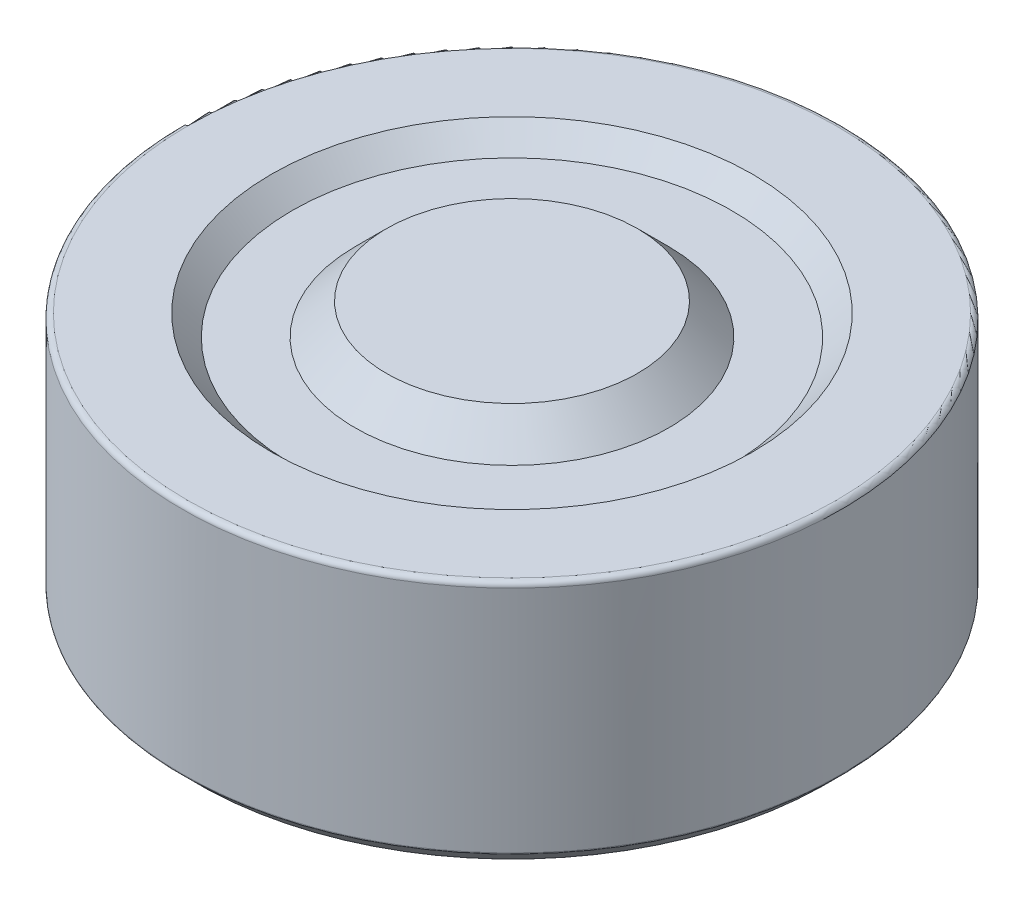
ISO-10303-21;
HEADER;
FILE_DESCRIPTION(('STEP AP214'),'2;1');
FILE_NAME('part.step','',(''),(''),'','','');
FILE_SCHEMA(('AUTOMOTIVE_DESIGN { 1 0 10303 214 1 1 1 1 }'));
ENDSEC;
DATA;
#1=APPLICATION_CONTEXT('core data for automotive mechanical design processes');
#2=APPLICATION_PROTOCOL_DEFINITION('international standard','automotive_design',2000,#1);
#3=PRODUCT_CONTEXT('',#1,'mechanical');
#4=PRODUCT('Part','Part','',(#3));
#5=PRODUCT_RELATED_PRODUCT_CATEGORY('part','',(#4));
#6=PRODUCT_DEFINITION_FORMATION('','',#4);
#7=PRODUCT_DEFINITION_CONTEXT('part definition',#1,'design');
#8=PRODUCT_DEFINITION('design','',#6,#7);
#9=PRODUCT_DEFINITION_SHAPE('','',#8);
#10=(LENGTH_UNIT() NAMED_UNIT(*) SI_UNIT(.MILLI.,.METRE.));
#11=(NAMED_UNIT(*) PLANE_ANGLE_UNIT() SI_UNIT($,.RADIAN.));
#12=(NAMED_UNIT(*) SI_UNIT($,.STERADIAN.) SOLID_ANGLE_UNIT());
#13=UNCERTAINTY_MEASURE_WITH_UNIT(LENGTH_MEASURE(1.E-05),#10,'distance_accuracy_value','');
#14=(GEOMETRIC_REPRESENTATION_CONTEXT(3) GLOBAL_UNCERTAINTY_ASSIGNED_CONTEXT((#13)) GLOBAL_UNIT_ASSIGNED_CONTEXT((#10,
#11,#12)) REPRESENTATION_CONTEXT('',''));
#15=CARTESIAN_POINT('',(0.,0.,0.));
#16=DIRECTION('',(0.,0.,1.));
#17=DIRECTION('',(1.,0.,0.));
#18=AXIS2_PLACEMENT_3D('',#15,#16,#17);
#19=CARTESIAN_POINT('',(0.,16.5,0.));
#20=DIRECTION('',(0.,-1.,0.));
#21=DIRECTION('',(0.,0.,-1.));
#22=AXIS2_PLACEMENT_3D('',#19,#20,#21);
#23=CONICAL_SURFACE('',#22,15.,0.785398163397448);
#24=CARTESIAN_POINT('',(0.,19.5,0.));
#25=DIRECTION('',(0.,-1.,0.));
#26=DIRECTION('',(0.,0.,-1.));
#27=AXIS2_PLACEMENT_3D('',#24,#25,#26);
#28=CIRCLE('',#27,12.);
#29=CARTESIAN_POINT('',(0.,19.5,-12.));
#30=VERTEX_POINT('',#29);
#31=EDGE_CURVE('E47',#30,#30,#28,.F.);
#32=ORIENTED_EDGE('',*,*,#31,.F.);
#33=EDGE_LOOP('',(#32));
#34=FACE_BOUND('',#33,.T.);
#35=CARTESIAN_POINT('',(0.,16.5,0.));
#36=DIRECTION('',(0.,-1.,0.));
#37=DIRECTION('',(-1.,0.,0.));
#38=AXIS2_PLACEMENT_3D('',#35,#36,#37);
#39=CIRCLE('',#38,15.);
#40=CARTESIAN_POINT('',(-15.,16.5,0.));
#41=VERTEX_POINT('',#40);
#42=EDGE_CURVE('E53',#41,#41,#39,.T.);
#43=ORIENTED_EDGE('',*,*,#42,.F.);
#44=EDGE_LOOP('',(#43));
#45=FACE_BOUND('',#44,.T.);
#46=ADVANCED_FACE('F17',(#34,#45),#23,.T.);
#47=CARTESIAN_POINT('',(0.,16.5,0.));
#48=DIRECTION('',(0.,-1.,0.));
#49=DIRECTION('',(1.,0.,0.));
#50=AXIS2_PLACEMENT_3D('',#47,#48,#49);
#51=PLANE('',#50);
#52=ORIENTED_EDGE('',*,*,#42,.T.);
#53=EDGE_LOOP('',(#52));
#54=FACE_BOUND('',#53,.T.);
#55=CARTESIAN_POINT('',(0.,16.5,0.));
#56=DIRECTION('',(0.,-1.,0.));
#57=DIRECTION('',(-1.,0.,0.));
#58=AXIS2_PLACEMENT_3D('',#55,#56,#57);
#59=CIRCLE('',#58,21.);
#60=CARTESIAN_POINT('',(-21.,16.5,0.));
#61=VERTEX_POINT('',#60);
#62=EDGE_CURVE('E49',#61,#61,#59,.T.);
#63=ORIENTED_EDGE('',*,*,#62,.F.);
#64=EDGE_LOOP('',(#63));
#65=FACE_BOUND('',#64,.T.);
#66=ADVANCED_FACE('F84',(#54,#65),#51,.F.);
#67=CARTESIAN_POINT('',(0.,18.5,0.));
#68=DIRECTION('',(0.,1.,0.));
#69=DIRECTION('',(0.,0.,1.));
#70=AXIS2_PLACEMENT_3D('',#67,#68,#69);
#71=CONICAL_SURFACE('',#70,23.,0.785398163397448);
#72=ORIENTED_EDGE('',*,*,#62,.T.);
#73=EDGE_LOOP('',(#72));
#74=FACE_BOUND('',#73,.T.);
#75=CARTESIAN_POINT('',(0.,18.5,0.));
#76=DIRECTION('',(0.,-1.,0.));
#77=DIRECTION('',(0.,0.,-1.));
#78=AXIS2_PLACEMENT_3D('',#75,#76,#77);
#79=CIRCLE('',#78,23.);
#80=CARTESIAN_POINT('',(0.,18.5,-23.));
#81=VERTEX_POINT('',#80);
#82=EDGE_CURVE('E30',#81,#81,#79,.T.);
#83=ORIENTED_EDGE('',*,*,#82,.F.);
#84=EDGE_LOOP('',(#83));
#85=FACE_BOUND('',#84,.T.);
#86=ADVANCED_FACE('F82',(#74,#85),#71,.F.);
#87=CARTESIAN_POINT('',(0.,18.5,0.));
#88=DIRECTION('',(0.,-1.,0.));
#89=DIRECTION('',(0.,0.,-1.));
#90=AXIS2_PLACEMENT_3D('',#87,#88,#89);
#91=PLANE('',#90);
#92=CARTESIAN_POINT('',(0.,18.5,0.));
#93=DIRECTION('',(0.,-1.,0.));
#94=DIRECTION('',(0.,0.,-1.));
#95=AXIS2_PLACEMENT_3D('',#92,#93,#94);
#96=CIRCLE('',#95,31.);
#97=CARTESIAN_POINT('',(0.,18.5,-31.));
#98=VERTEX_POINT('',#97);
#99=EDGE_CURVE('E10',#98,#98,#96,.F.);
#100=ORIENTED_EDGE('',*,*,#99,.T.);
#101=EDGE_LOOP('',(#100));
#102=FACE_BOUND('',#101,.T.);
#103=ORIENTED_EDGE('',*,*,#82,.T.);
#104=EDGE_LOOP('',(#103));
#105=FACE_BOUND('',#104,.T.);
#106=ADVANCED_FACE('F80',(#102,#105),#91,.F.);
#107=CARTESIAN_POINT('',(0.,13.,0.));
#108=DIRECTION('',(0.,-1.,0.));
#109=DIRECTION('',(0.,0.,-1.));
#110=AXIS2_PLACEMENT_3D('',#107,#108,#109);
#111=CYLINDRICAL_SURFACE('',#110,31.5);
#112=CARTESIAN_POINT('',(0.,18.,0.));
#113=DIRECTION('',(0.,-1.,0.));
#114=DIRECTION('',(0.,0.,-1.));
#115=AXIS2_PLACEMENT_3D('',#112,#113,#114);
#116=CIRCLE('',#115,31.5);
#117=CARTESIAN_POINT('',(0.,18.,-31.5));
#118=VERTEX_POINT('',#117);
#119=EDGE_CURVE('E25',#118,#118,#116,.T.);
#120=ORIENTED_EDGE('',*,*,#119,.T.);
#121=EDGE_LOOP('',(#120));
#122=FACE_BOUND('',#121,.T.);
#123=CARTESIAN_POINT('',(0.,-3.91715728752538,0.));
#124=DIRECTION('',(0.,1.,0.));
#125=DIRECTION('',(0.,0.,1.));
#126=AXIS2_PLACEMENT_3D('',#123,#124,#125);
#127=CIRCLE('',#126,31.5);
#128=CARTESIAN_POINT('',(0.,-3.91715728752538,31.5));
#129=VERTEX_POINT('',#128);
#130=EDGE_CURVE('E38',#129,#129,#127,.T.);
#131=ORIENTED_EDGE('',*,*,#130,.T.);
#132=EDGE_LOOP('',(#131));
#133=FACE_BOUND('',#132,.T.);
#134=ADVANCED_FACE('F93',(#122,#133),#111,.T.);
#135=CARTESIAN_POINT('',(0.,-5.5,0.));
#136=DIRECTION('',(0.,-1.,0.));
#137=DIRECTION('',(0.,0.,-1.));
#138=AXIS2_PLACEMENT_3D('',#135,#136,#137);
#139=PLANE('',#138);
#140=CARTESIAN_POINT('',(0.,-5.5,0.));
#141=DIRECTION('',(0.,-1.,0.));
#142=DIRECTION('',(0.,0.,-1.));
#143=AXIS2_PLACEMENT_3D('',#140,#141,#142);
#144=CIRCLE('',#143,24.);
#145=CARTESIAN_POINT('',(0.,-5.5,-24.));
#146=VERTEX_POINT('',#145);
#147=EDGE_CURVE('E45',#146,#146,#144,.F.);
#148=ORIENTED_EDGE('',*,*,#147,.T.);
#149=EDGE_LOOP('',(#148));
#150=FACE_BOUND('',#149,.T.);
#151=CARTESIAN_POINT('',(0.,-5.5,0.));
#152=DIRECTION('',(0.,-1.,0.));
#153=DIRECTION('',(0.,0.,-1.));
#154=AXIS2_PLACEMENT_3D('',#151,#152,#153);
#155=CIRCLE('',#154,29.9171572875254);
#156=CARTESIAN_POINT('',(0.,-5.5,-29.9171572875254));
#157=VERTEX_POINT('',#156);
#158=EDGE_CURVE('E37',#157,#157,#155,.T.);
#159=ORIENTED_EDGE('',*,*,#158,.T.);
#160=EDGE_LOOP('',(#159));
#161=FACE_BOUND('',#160,.T.);
#162=ADVANCED_FACE('F111',(#150,#161),#139,.T.);
#163=CARTESIAN_POINT('',(0.,-5.5,0.));
#164=DIRECTION('',(0.,1.,0.));
#165=DIRECTION('',(0.,0.,1.));
#166=AXIS2_PLACEMENT_3D('',#163,#164,#165);
#167=CONICAL_SURFACE('',#166,30.,0.785398163397448);
#168=CARTESIAN_POINT('',(0.,-5.44142135623731,0.));
#169=DIRECTION('',(0.,-1.,0.));
#170=DIRECTION('',(0.,0.,-1.));
#171=AXIS2_PLACEMENT_3D('',#168,#169,#170);
#172=CIRCLE('',#171,30.0585786437627);
#173=CARTESIAN_POINT('',(0.,-5.44142135623731,-30.0585786437627));
#174=VERTEX_POINT('',#173);
#175=EDGE_CURVE('E42',#174,#174,#172,.F.);
#176=ORIENTED_EDGE('',*,*,#175,.T.);
#177=EDGE_LOOP('',(#176));
#178=FACE_BOUND('',#177,.T.);
#179=CARTESIAN_POINT('',(0.,-4.05857864376269,0.));
#180=DIRECTION('',(0.,-1.,0.));
#181=DIRECTION('',(0.,0.,-1.));
#182=AXIS2_PLACEMENT_3D('',#179,#180,#181);
#183=CIRCLE('',#182,31.4414213562373);
#184=CARTESIAN_POINT('',(0.,-4.05857864376269,-31.4414213562373));
#185=VERTEX_POINT('',#184);
#186=EDGE_CURVE('E34',#185,#185,#183,.T.);
#187=ORIENTED_EDGE('',*,*,#186,.T.);
#188=EDGE_LOOP('',(#187));
#189=FACE_BOUND('',#188,.T.);
#190=ADVANCED_FACE('F118',(#178,#189),#167,.T.);
#191=CARTESIAN_POINT('',(0.,-3.91715728752538,0.));
#192=DIRECTION('',(0.,1.,0.));
#193=DIRECTION('',(0.,0.,1.));
#194=AXIS2_PLACEMENT_3D('',#191,#192,#193);
#195=TOROIDAL_SURFACE('',#194,31.3,0.2);
#196=ORIENTED_EDGE('',*,*,#186,.F.);
#197=EDGE_LOOP('',(#196));
#198=FACE_BOUND('',#197,.T.);
#199=ORIENTED_EDGE('',*,*,#130,.F.);
#200=EDGE_LOOP('',(#199));
#201=FACE_BOUND('',#200,.T.);
#202=ADVANCED_FACE('F116',(#198,#201),#195,.T.);
#203=CARTESIAN_POINT('',(0.,-5.3,0.));
#204=DIRECTION('',(0.,-1.,0.));
#205=DIRECTION('',(0.,0.,-1.));
#206=AXIS2_PLACEMENT_3D('',#203,#204,#205);
#207=TOROIDAL_SURFACE('',#206,29.9171572875254,0.2);
#208=ORIENTED_EDGE('',*,*,#175,.F.);
#209=EDGE_LOOP('',(#208));
#210=FACE_BOUND('',#209,.T.);
#211=ORIENTED_EDGE('',*,*,#158,.F.);
#212=EDGE_LOOP('',(#211));
#213=FACE_BOUND('',#212,.T.);
#214=ADVANCED_FACE('F19',(#210,#213),#207,.T.);
#215=CARTESIAN_POINT('',(0.,-3.5,0.));
#216=DIRECTION('',(0.,1.,0.));
#217=DIRECTION('',(0.,0.,1.));
#218=AXIS2_PLACEMENT_3D('',#215,#216,#217);
#219=PLANE('',#218);
#220=CARTESIAN_POINT('',(0.,-3.5,0.));
#221=DIRECTION('',(0.,1.,0.));
#222=DIRECTION('',(0.,0.,1.));
#223=AXIS2_PLACEMENT_3D('',#220,#221,#222);
#224=CIRCLE('',#223,22.);
#225=CARTESIAN_POINT('',(0.,-3.5,22.));
#226=VERTEX_POINT('',#225);
#227=EDGE_CURVE('E75',#226,#226,#224,.F.);
#228=ORIENTED_EDGE('',*,*,#227,.T.);
#229=EDGE_LOOP('',(#228));
#230=FACE_BOUND('',#229,.T.);
#231=CARTESIAN_POINT('',(0.,-3.5,0.));
#232=DIRECTION('',(0.,-1.,0.));
#233=DIRECTION('',(1.,0.,0.));
#234=AXIS2_PLACEMENT_3D('',#231,#232,#233);
#235=CIRCLE('',#234,15.);
#236=CARTESIAN_POINT('',(15.,-3.5,0.));
#237=VERTEX_POINT('',#236);
#238=EDGE_CURVE('E41',#237,#237,#235,.T.);
#239=ORIENTED_EDGE('',*,*,#238,.F.);
#240=EDGE_LOOP('',(#239));
#241=FACE_BOUND('',#240,.T.);
#242=ADVANCED_FACE('F124',(#230,#241),#219,.F.);
#243=CARTESIAN_POINT('',(0.,-5.5,0.));
#244=DIRECTION('',(0.,-1.,0.));
#245=DIRECTION('',(0.,0.,-1.));
#246=AXIS2_PLACEMENT_3D('',#243,#244,#245);
#247=CONICAL_SURFACE('',#246,24.,0.785398163397448);
#248=ORIENTED_EDGE('',*,*,#227,.F.);
#249=EDGE_LOOP('',(#248));
#250=FACE_BOUND('',#249,.T.);
#251=ORIENTED_EDGE('',*,*,#147,.F.);
#252=EDGE_LOOP('',(#251));
#253=FACE_BOUND('',#252,.T.);
#254=ADVANCED_FACE('F64',(#250,#253),#247,.F.);
#255=CARTESIAN_POINT('',(0.,-3.5,0.));
#256=DIRECTION('',(0.,1.,0.));
#257=DIRECTION('',(0.,0.,1.));
#258=AXIS2_PLACEMENT_3D('',#255,#256,#257);
#259=CONICAL_SURFACE('',#258,15.,0.785398163397448);
#260=CARTESIAN_POINT('',(0.,-6.5,0.));
#261=DIRECTION('',(0.,1.,0.));
#262=DIRECTION('',(0.,0.,1.));
#263=AXIS2_PLACEMENT_3D('',#260,#261,#262);
#264=CIRCLE('',#263,12.);
#265=CARTESIAN_POINT('',(0.,-6.5,12.));
#266=VERTEX_POINT('',#265);
#267=EDGE_CURVE('E21',#266,#266,#264,.F.);
#268=ORIENTED_EDGE('',*,*,#267,.F.);
#269=EDGE_LOOP('',(#268));
#270=FACE_BOUND('',#269,.T.);
#271=ORIENTED_EDGE('',*,*,#238,.T.);
#272=EDGE_LOOP('',(#271));
#273=FACE_BOUND('',#272,.T.);
#274=ADVANCED_FACE('F60',(#270,#273),#259,.T.);
#275=CARTESIAN_POINT('',(0.,18.,0.));
#276=DIRECTION('',(0.,-1.,0.));
#277=DIRECTION('',(0.,0.,-1.));
#278=AXIS2_PLACEMENT_3D('',#275,#276,#277);
#279=TOROIDAL_SURFACE('',#278,31.,0.5);
#280=ORIENTED_EDGE('',*,*,#99,.F.);
#281=EDGE_LOOP('',(#280));
#282=FACE_BOUND('',#281,.T.);
#283=ORIENTED_EDGE('',*,*,#119,.F.);
#284=EDGE_LOOP('',(#283));
#285=FACE_BOUND('',#284,.T.);
#286=ADVANCED_FACE('F63',(#282,#285),#279,.T.);
#287=CARTESIAN_POINT('',(0.,19.5,0.));
#288=DIRECTION('',(0.,-1.,0.));
#289=DIRECTION('',(0.,0.,-1.));
#290=AXIS2_PLACEMENT_3D('',#287,#288,#289);
#291=PLANE('',#290);
#292=ORIENTED_EDGE('',*,*,#31,.T.);
#293=EDGE_LOOP('',(#292));
#294=FACE_BOUND('',#293,.T.);
#295=ADVANCED_FACE('F114',(#294),#291,.F.);
#296=CARTESIAN_POINT('',(0.,-6.5,0.));
#297=DIRECTION('',(0.,1.,0.));
#298=DIRECTION('',(0.,0.,1.));
#299=AXIS2_PLACEMENT_3D('',#296,#297,#298);
#300=PLANE('',#299);
#301=ORIENTED_EDGE('',*,*,#267,.T.);
#302=EDGE_LOOP('',(#301));
#303=FACE_BOUND('',#302,.T.);
#304=ADVANCED_FACE('F58',(#303),#300,.F.);
#305=CLOSED_SHELL('',(#46,#66,#86,#106,#134,#162,#190,#202,#214,#242,#254,#274,#286,#295,#304));
#306=MANIFOLD_SOLID_BREP('B1',#305);
#307=ADVANCED_BREP_SHAPE_REPRESENTATION('',(#18,#306),#14);
#308=SHAPE_DEFINITION_REPRESENTATION(#9,#307);
ENDSEC;
END-ISO-10303-21;
